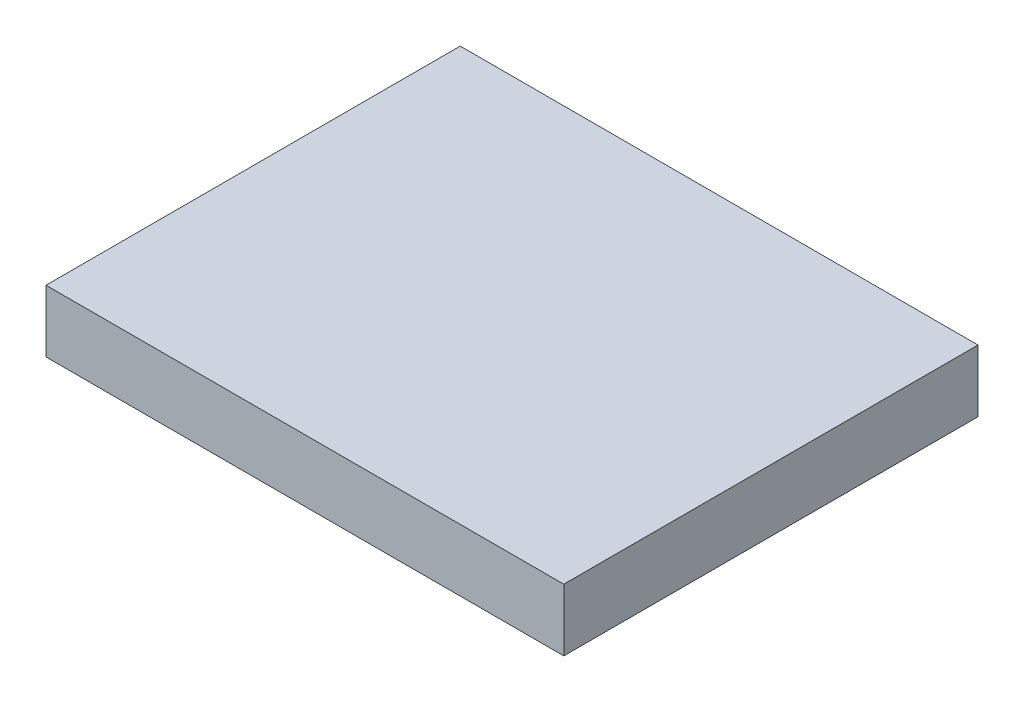
ISO-10303-21;
HEADER;
FILE_DESCRIPTION(('STEP AP214'),'2;1');
FILE_NAME('part.step','',(''),(''),'','','');
FILE_SCHEMA(('AUTOMOTIVE_DESIGN { 1 0 10303 214 1 1 1 1 }'));
ENDSEC;
DATA;
#1=APPLICATION_CONTEXT('core data for automotive mechanical design processes');
#2=APPLICATION_PROTOCOL_DEFINITION('international standard','automotive_design',2000,#1);
#3=PRODUCT_CONTEXT('',#1,'mechanical');
#4=PRODUCT('Part','Part','',(#3));
#5=PRODUCT_RELATED_PRODUCT_CATEGORY('part','',(#4));
#6=PRODUCT_DEFINITION_FORMATION('','',#4);
#7=PRODUCT_DEFINITION_CONTEXT('part definition',#1,'design');
#8=PRODUCT_DEFINITION('design','',#6,#7);
#9=PRODUCT_DEFINITION_SHAPE('','',#8);
#10=(LENGTH_UNIT() NAMED_UNIT(*) SI_UNIT(.MILLI.,.METRE.));
#11=(NAMED_UNIT(*) PLANE_ANGLE_UNIT() SI_UNIT($,.RADIAN.));
#12=(NAMED_UNIT(*) SI_UNIT($,.STERADIAN.) SOLID_ANGLE_UNIT());
#13=UNCERTAINTY_MEASURE_WITH_UNIT(LENGTH_MEASURE(1.E-05),#10,'distance_accuracy_value','');
#14=(GEOMETRIC_REPRESENTATION_CONTEXT(3) GLOBAL_UNCERTAINTY_ASSIGNED_CONTEXT((#13)) GLOBAL_UNIT_ASSIGNED_CONTEXT((#10,
#11,#12)) REPRESENTATION_CONTEXT('',''));
#15=CARTESIAN_POINT('',(0.,0.,0.));
#16=DIRECTION('',(0.,0.,1.));
#17=DIRECTION('',(1.,0.,0.));
#18=AXIS2_PLACEMENT_3D('',#15,#16,#17);
#19=CARTESIAN_POINT('',(12.5,3.,-10.));
#20=DIRECTION('',(-1.,0.,0.));
#21=DIRECTION('',(0.,0.,1.));
#22=AXIS2_PLACEMENT_3D('',#19,#20,#21);
#23=PLANE('',#22);
#24=DIRECTION('',(0.,0.,-1.));
#25=VECTOR('',#24,1.);
#26=CARTESIAN_POINT('',(12.5,0.,-10.));
#27=LINE('',#26,#25);
#28=CARTESIAN_POINT('',(12.5,0.,10.));
#29=VERTEX_POINT('',#28);
#30=CARTESIAN_POINT('',(12.5,0.,-10.));
#31=VERTEX_POINT('',#30);
#32=EDGE_CURVE('E96',#29,#31,#27,.T.);
#33=ORIENTED_EDGE('',*,*,#32,.T.);
#34=DIRECTION('',(0.,-1.,0.));
#35=VECTOR('',#34,1.);
#36=CARTESIAN_POINT('',(12.5,3.,-10.));
#37=LINE('',#36,#35);
#38=CARTESIAN_POINT('',(12.5,3.,-10.));
#39=VERTEX_POINT('',#38);
#40=EDGE_CURVE('E11',#39,#31,#37,.T.);
#41=ORIENTED_EDGE('',*,*,#40,.F.);
#42=DIRECTION('',(0.,0.,-1.));
#43=VECTOR('',#42,1.);
#44=CARTESIAN_POINT('',(12.5,3.,-10.));
#45=LINE('',#44,#43);
#46=CARTESIAN_POINT('',(12.5,3.,10.));
#47=VERTEX_POINT('',#46);
#48=EDGE_CURVE('E84',#47,#39,#45,.T.);
#49=ORIENTED_EDGE('',*,*,#48,.F.);
#50=DIRECTION('',(0.,-1.,0.));
#51=VECTOR('',#50,1.);
#52=CARTESIAN_POINT('',(12.5,3.,10.));
#53=LINE('',#52,#51);
#54=EDGE_CURVE('E92',#47,#29,#53,.T.);
#55=ORIENTED_EDGE('',*,*,#54,.T.);
#56=EDGE_LOOP('',(#33,#41,#49,#55));
#57=FACE_BOUND('',#56,.T.);
#58=ADVANCED_FACE('F33',(#57),#23,.F.);
#59=CARTESIAN_POINT('',(-12.5,3.,-10.));
#60=DIRECTION('',(0.,0.,1.));
#61=DIRECTION('',(1.,0.,0.));
#62=AXIS2_PLACEMENT_3D('',#59,#60,#61);
#63=PLANE('',#62);
#64=DIRECTION('',(-1.,0.,0.));
#65=VECTOR('',#64,1.);
#66=CARTESIAN_POINT('',(-12.5,0.,-10.));
#67=LINE('',#66,#65);
#68=CARTESIAN_POINT('',(-12.5,0.,-10.));
#69=VERTEX_POINT('',#68);
#70=EDGE_CURVE('E88',#31,#69,#67,.T.);
#71=ORIENTED_EDGE('',*,*,#70,.T.);
#72=DIRECTION('',(0.,-1.,0.));
#73=VECTOR('',#72,1.);
#74=CARTESIAN_POINT('',(-12.5,3.,-10.));
#75=LINE('',#74,#73);
#76=CARTESIAN_POINT('',(-12.5,3.,-10.));
#77=VERTEX_POINT('',#76);
#78=EDGE_CURVE('E41',#77,#69,#75,.T.);
#79=ORIENTED_EDGE('',*,*,#78,.F.);
#80=DIRECTION('',(-1.,0.,0.));
#81=VECTOR('',#80,1.);
#82=CARTESIAN_POINT('',(-12.5,3.,-10.));
#83=LINE('',#82,#81);
#84=EDGE_CURVE('E79',#39,#77,#83,.T.);
#85=ORIENTED_EDGE('',*,*,#84,.F.);
#86=ORIENTED_EDGE('',*,*,#40,.T.);
#87=EDGE_LOOP('',(#71,#79,#85,#86));
#88=FACE_BOUND('',#87,.T.);
#89=ADVANCED_FACE('F87',(#88),#63,.F.);
#90=CARTESIAN_POINT('',(-12.5,3.,-10.));
#91=DIRECTION('',(1.,0.,0.));
#92=DIRECTION('',(0.,0.,-1.));
#93=AXIS2_PLACEMENT_3D('',#90,#91,#92);
#94=PLANE('',#93);
#95=DIRECTION('',(0.,0.,1.));
#96=VECTOR('',#95,1.);
#97=CARTESIAN_POINT('',(-12.5,0.,-10.));
#98=LINE('',#97,#96);
#99=CARTESIAN_POINT('',(-12.5,0.,10.));
#100=VERTEX_POINT('',#99);
#101=EDGE_CURVE('E66',#69,#100,#98,.T.);
#102=ORIENTED_EDGE('',*,*,#101,.T.);
#103=DIRECTION('',(0.,-1.,0.));
#104=VECTOR('',#103,1.);
#105=CARTESIAN_POINT('',(-12.5,3.,10.));
#106=LINE('',#105,#104);
#107=CARTESIAN_POINT('',(-12.5,3.,10.));
#108=VERTEX_POINT('',#107);
#109=EDGE_CURVE('E89',#108,#100,#106,.T.);
#110=ORIENTED_EDGE('',*,*,#109,.F.);
#111=DIRECTION('',(0.,0.,1.));
#112=VECTOR('',#111,1.);
#113=CARTESIAN_POINT('',(-12.5,3.,-10.));
#114=LINE('',#113,#112);
#115=EDGE_CURVE('E82',#77,#108,#114,.T.);
#116=ORIENTED_EDGE('',*,*,#115,.F.);
#117=ORIENTED_EDGE('',*,*,#78,.T.);
#118=EDGE_LOOP('',(#102,#110,#116,#117));
#119=FACE_BOUND('',#118,.T.);
#120=ADVANCED_FACE('F90',(#119),#94,.F.);
#121=CARTESIAN_POINT('',(-12.5,3.,10.));
#122=DIRECTION('',(0.,0.,-1.));
#123=DIRECTION('',(-1.,0.,0.));
#124=AXIS2_PLACEMENT_3D('',#121,#122,#123);
#125=PLANE('',#124);
#126=DIRECTION('',(1.,0.,0.));
#127=VECTOR('',#126,1.);
#128=CARTESIAN_POINT('',(-12.5,0.,10.));
#129=LINE('',#128,#127);
#130=EDGE_CURVE('E72',#100,#29,#129,.T.);
#131=ORIENTED_EDGE('',*,*,#130,.T.);
#132=ORIENTED_EDGE('',*,*,#54,.F.);
#133=DIRECTION('',(1.,0.,0.));
#134=VECTOR('',#133,1.);
#135=CARTESIAN_POINT('',(-12.5,3.,10.));
#136=LINE('',#135,#134);
#137=EDGE_CURVE('E49',#108,#47,#136,.T.);
#138=ORIENTED_EDGE('',*,*,#137,.F.);
#139=ORIENTED_EDGE('',*,*,#109,.T.);
#140=EDGE_LOOP('',(#131,#132,#138,#139));
#141=FACE_BOUND('',#140,.T.);
#142=ADVANCED_FACE('F103',(#141),#125,.F.);
#143=CARTESIAN_POINT('',(0.,3.,0.));
#144=DIRECTION('',(0.,1.,0.));
#145=DIRECTION('',(0.,0.,1.));
#146=AXIS2_PLACEMENT_3D('',#143,#144,#145);
#147=PLANE('',#146);
#148=ORIENTED_EDGE('',*,*,#48,.T.);
#149=ORIENTED_EDGE('',*,*,#84,.T.);
#150=ORIENTED_EDGE('',*,*,#115,.T.);
#151=ORIENTED_EDGE('',*,*,#137,.T.);
#152=EDGE_LOOP('',(#148,#149,#150,#151));
#153=FACE_BOUND('',#152,.T.);
#154=ADVANCED_FACE('F80',(#153),#147,.T.);
#155=CARTESIAN_POINT('',(0.,0.,0.));
#156=DIRECTION('',(0.,1.,0.));
#157=DIRECTION('',(0.,0.,1.));
#158=AXIS2_PLACEMENT_3D('',#155,#156,#157);
#159=PLANE('',#158);
#160=ORIENTED_EDGE('',*,*,#32,.F.);
#161=ORIENTED_EDGE('',*,*,#130,.F.);
#162=ORIENTED_EDGE('',*,*,#101,.F.);
#163=ORIENTED_EDGE('',*,*,#70,.F.);
#164=EDGE_LOOP('',(#160,#161,#162,#163));
#165=FACE_BOUND('',#164,.T.);
#166=ADVANCED_FACE('F106',(#165),#159,.F.);
#167=CLOSED_SHELL('',(#58,#89,#120,#142,#154,#166));
#168=MANIFOLD_SOLID_BREP('B2',#167);
#169=ADVANCED_BREP_SHAPE_REPRESENTATION('',(#18,#168),#14);
#170=SHAPE_DEFINITION_REPRESENTATION(#9,#169);
ENDSEC;
END-ISO-10303-21;
